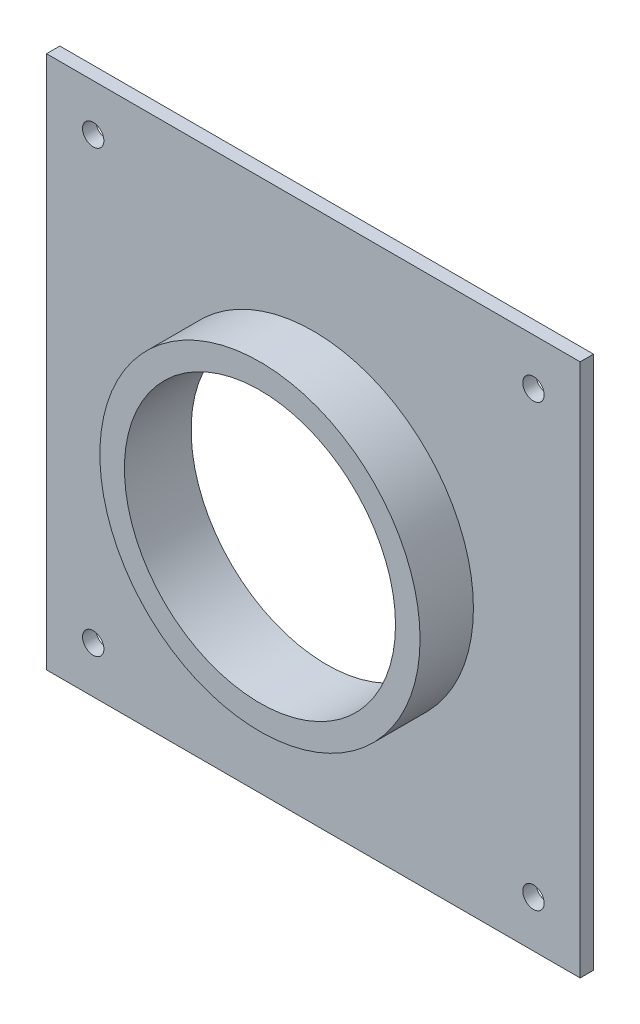
ISO-10303-21;
HEADER;
FILE_DESCRIPTION(('STEP AP214'),'2;1');
FILE_NAME('part.step','',(''),(''),'','','');
FILE_SCHEMA(('AUTOMOTIVE_DESIGN { 1 0 10303 214 1 1 1 1 }'));
ENDSEC;
DATA;
#1=APPLICATION_CONTEXT('core data for automotive mechanical design processes');
#2=APPLICATION_PROTOCOL_DEFINITION('international standard','automotive_design',2000,#1);
#3=PRODUCT_CONTEXT('',#1,'mechanical');
#4=PRODUCT('Part','Part','',(#3));
#5=PRODUCT_RELATED_PRODUCT_CATEGORY('part','',(#4));
#6=PRODUCT_DEFINITION_FORMATION('','',#4);
#7=PRODUCT_DEFINITION_CONTEXT('part definition',#1,'design');
#8=PRODUCT_DEFINITION('design','',#6,#7);
#9=PRODUCT_DEFINITION_SHAPE('','',#8);
#10=(LENGTH_UNIT() NAMED_UNIT(*) SI_UNIT(.MILLI.,.METRE.));
#11=(NAMED_UNIT(*) PLANE_ANGLE_UNIT() SI_UNIT($,.RADIAN.));
#12=(NAMED_UNIT(*) SI_UNIT($,.STERADIAN.) SOLID_ANGLE_UNIT());
#13=UNCERTAINTY_MEASURE_WITH_UNIT(LENGTH_MEASURE(1.E-05),#10,'distance_accuracy_value','');
#14=(GEOMETRIC_REPRESENTATION_CONTEXT(3) GLOBAL_UNCERTAINTY_ASSIGNED_CONTEXT((#13)) GLOBAL_UNIT_ASSIGNED_CONTEXT((#10,
#11,#12)) REPRESENTATION_CONTEXT('',''));
#15=CARTESIAN_POINT('',(0.,0.,0.));
#16=DIRECTION('',(0.,0.,1.));
#17=DIRECTION('',(1.,0.,0.));
#18=AXIS2_PLACEMENT_3D('',#15,#16,#17);
#19=CARTESIAN_POINT('',(0.,0.,1.));
#20=DIRECTION('',(0.,0.,1.));
#21=DIRECTION('',(1.,0.,0.));
#22=AXIS2_PLACEMENT_3D('',#19,#20,#21);
#23=PLANE('',#22);
#24=CARTESIAN_POINT('',(-16.5,16.5,1.));
#25=DIRECTION('',(0.,0.,1.));
#26=DIRECTION('',(1.,0.,0.));
#27=AXIS2_PLACEMENT_3D('',#24,#25,#26);
#28=CIRCLE('',#27,0.799999999999992);
#29=CARTESIAN_POINT('',(-15.7,16.5,1.));
#30=VERTEX_POINT('',#29);
#31=EDGE_CURVE('E157',#30,#30,#28,.T.);
#32=ORIENTED_EDGE('',*,*,#31,.F.);
#33=EDGE_LOOP('',(#32));
#34=FACE_BOUND('',#33,.T.);
#35=CARTESIAN_POINT('',(16.5,16.5,1.));
#36=DIRECTION('',(0.,0.,1.));
#37=DIRECTION('',(1.,0.,0.));
#38=AXIS2_PLACEMENT_3D('',#35,#36,#37);
#39=CIRCLE('',#38,0.799999999999988);
#40=CARTESIAN_POINT('',(17.3,16.5,1.));
#41=VERTEX_POINT('',#40);
#42=EDGE_CURVE('E144',#41,#41,#39,.T.);
#43=ORIENTED_EDGE('',*,*,#42,.F.);
#44=EDGE_LOOP('',(#43));
#45=FACE_BOUND('',#44,.T.);
#46=CARTESIAN_POINT('',(16.5000000000004,-16.5,1.));
#47=DIRECTION('',(0.,0.,1.));
#48=DIRECTION('',(1.,0.,0.));
#49=AXIS2_PLACEMENT_3D('',#46,#47,#48);
#50=CIRCLE('',#49,0.799999999999988);
#51=CARTESIAN_POINT('',(17.3000000000004,-16.5,1.));
#52=VERTEX_POINT('',#51);
#53=EDGE_CURVE('E140',#52,#52,#50,.T.);
#54=ORIENTED_EDGE('',*,*,#53,.F.);
#55=EDGE_LOOP('',(#54));
#56=FACE_BOUND('',#55,.T.);
#57=CARTESIAN_POINT('',(-16.4999999999996,-16.5,1.));
#58=DIRECTION('',(0.,0.,1.));
#59=DIRECTION('',(1.,0.,0.));
#60=AXIS2_PLACEMENT_3D('',#57,#58,#59);
#61=CIRCLE('',#60,0.799999999999992);
#62=CARTESIAN_POINT('',(-15.6999999999996,-16.5,1.));
#63=VERTEX_POINT('',#62);
#64=EDGE_CURVE('E136',#63,#63,#61,.T.);
#65=ORIENTED_EDGE('',*,*,#64,.F.);
#66=EDGE_LOOP('',(#65));
#67=FACE_BOUND('',#66,.T.);
#68=DIRECTION('',(-1.,0.,0.));
#69=VECTOR('',#68,1.);
#70=CARTESIAN_POINT('',(0.,20.,1.));
#71=LINE('',#70,#69);
#72=CARTESIAN_POINT('',(20.,20.,1.));
#73=VERTEX_POINT('',#72);
#74=CARTESIAN_POINT('',(-20.,20.,1.));
#75=VERTEX_POINT('',#74);
#76=EDGE_CURVE('E115',#73,#75,#71,.T.);
#77=ORIENTED_EDGE('',*,*,#76,.T.);
#78=DIRECTION('',(0.,-1.,0.));
#79=VECTOR('',#78,1.);
#80=CARTESIAN_POINT('',(-20.,0.,1.));
#81=LINE('',#80,#79);
#82=CARTESIAN_POINT('',(-20.,-20.,1.));
#83=VERTEX_POINT('',#82);
#84=EDGE_CURVE('E135',#75,#83,#81,.T.);
#85=ORIENTED_EDGE('',*,*,#84,.T.);
#86=DIRECTION('',(-1.,0.,0.));
#87=VECTOR('',#86,1.);
#88=CARTESIAN_POINT('',(0.,-20.,1.));
#89=LINE('',#88,#87);
#90=CARTESIAN_POINT('',(20.,-20.,1.));
#91=VERTEX_POINT('',#90);
#92=EDGE_CURVE('E96',#91,#83,#89,.T.);
#93=ORIENTED_EDGE('',*,*,#92,.F.);
#94=DIRECTION('',(0.,1.,0.));
#95=VECTOR('',#94,1.);
#96=CARTESIAN_POINT('',(20.,0.,1.));
#97=LINE('',#96,#95);
#98=EDGE_CURVE('E93',#91,#73,#97,.T.);
#99=ORIENTED_EDGE('',*,*,#98,.T.);
#100=EDGE_LOOP('',(#77,#85,#93,#99));
#101=FACE_BOUND('',#100,.T.);
#102=CARTESIAN_POINT('',(0.,0.,1.));
#103=DIRECTION('',(0.,0.,1.));
#104=DIRECTION('',(1.,0.,0.));
#105=AXIS2_PLACEMENT_3D('',#102,#103,#104);
#106=CIRCLE('',#105,12.);
#107=CARTESIAN_POINT('',(12.,0.,1.));
#108=VERTEX_POINT('',#107);
#109=EDGE_CURVE('E107',#108,#108,#106,.F.);
#110=ORIENTED_EDGE('',*,*,#109,.T.);
#111=EDGE_LOOP('',(#110));
#112=FACE_BOUND('',#111,.T.);
#113=ADVANCED_FACE('F49',(#34,#45,#56,#67,#101,#112),#23,.T.);
#114=CARTESIAN_POINT('',(0.,0.,5.));
#115=DIRECTION('',(0.,0.,1.));
#116=DIRECTION('',(1.,0.,0.));
#117=AXIS2_PLACEMENT_3D('',#114,#115,#116);
#118=PLANE('',#117);
#119=CARTESIAN_POINT('',(0.,0.,5.));
#120=DIRECTION('',(0.,0.,1.));
#121=DIRECTION('',(1.,0.,0.));
#122=AXIS2_PLACEMENT_3D('',#119,#120,#121);
#123=CIRCLE('',#122,10.16);
#124=CARTESIAN_POINT('',(10.16,0.,5.));
#125=VERTEX_POINT('',#124);
#126=EDGE_CURVE('E11',#125,#125,#123,.T.);
#127=ORIENTED_EDGE('',*,*,#126,.F.);
#128=EDGE_LOOP('',(#127));
#129=FACE_BOUND('',#128,.T.);
#130=CARTESIAN_POINT('',(0.,0.,5.));
#131=DIRECTION('',(0.,0.,1.));
#132=DIRECTION('',(1.,0.,0.));
#133=AXIS2_PLACEMENT_3D('',#130,#131,#132);
#134=CIRCLE('',#133,12.);
#135=CARTESIAN_POINT('',(12.,0.,5.));
#136=VERTEX_POINT('',#135);
#137=EDGE_CURVE('E166',#136,#136,#134,.T.);
#138=ORIENTED_EDGE('',*,*,#137,.T.);
#139=EDGE_LOOP('',(#138));
#140=FACE_BOUND('',#139,.T.);
#141=ADVANCED_FACE('F189',(#129,#140),#118,.T.);
#142=CARTESIAN_POINT('',(0.,0.,5.));
#143=DIRECTION('',(0.,0.,-1.));
#144=DIRECTION('',(-1.,0.,0.));
#145=AXIS2_PLACEMENT_3D('',#142,#143,#144);
#146=CYLINDRICAL_SURFACE('',#145,10.16);
#147=ORIENTED_EDGE('',*,*,#126,.T.);
#148=EDGE_LOOP('',(#147));
#149=FACE_BOUND('',#148,.T.);
#150=CARTESIAN_POINT('',(0.,0.,0.));
#151=DIRECTION('',(0.,0.,1.));
#152=DIRECTION('',(1.,0.,0.));
#153=AXIS2_PLACEMENT_3D('',#150,#151,#152);
#154=CIRCLE('',#153,10.16);
#155=CARTESIAN_POINT('',(10.16,0.,0.));
#156=VERTEX_POINT('',#155);
#157=EDGE_CURVE('E60',#156,#156,#154,.T.);
#158=ORIENTED_EDGE('',*,*,#157,.F.);
#159=EDGE_LOOP('',(#158));
#160=FACE_BOUND('',#159,.T.);
#161=ADVANCED_FACE('F51',(#149,#160),#146,.F.);
#162=CARTESIAN_POINT('',(0.,0.,0.));
#163=DIRECTION('',(0.,0.,1.));
#164=DIRECTION('',(1.,0.,0.));
#165=AXIS2_PLACEMENT_3D('',#162,#163,#164);
#166=PLANE('',#165);
#167=CARTESIAN_POINT('',(-16.5,16.5,0.));
#168=DIRECTION('',(0.,0.,1.));
#169=DIRECTION('',(1.,0.,0.));
#170=AXIS2_PLACEMENT_3D('',#167,#168,#169);
#171=CIRCLE('',#170,0.79999999999999);
#172=CARTESIAN_POINT('',(-15.7,16.5,0.));
#173=VERTEX_POINT('',#172);
#174=EDGE_CURVE('E53',#173,#173,#171,.T.);
#175=ORIENTED_EDGE('',*,*,#174,.T.);
#176=EDGE_LOOP('',(#175));
#177=FACE_BOUND('',#176,.T.);
#178=CARTESIAN_POINT('',(16.5,16.5,0.));
#179=DIRECTION('',(0.,0.,1.));
#180=DIRECTION('',(1.,0.,0.));
#181=AXIS2_PLACEMENT_3D('',#178,#179,#180);
#182=CIRCLE('',#181,0.799999999999988);
#183=CARTESIAN_POINT('',(17.3,16.5,0.));
#184=VERTEX_POINT('',#183);
#185=EDGE_CURVE('E141',#184,#184,#182,.T.);
#186=ORIENTED_EDGE('',*,*,#185,.T.);
#187=EDGE_LOOP('',(#186));
#188=FACE_BOUND('',#187,.T.);
#189=CARTESIAN_POINT('',(16.5000000000004,-16.5,0.));
#190=DIRECTION('',(0.,0.,1.));
#191=DIRECTION('',(1.,0.,0.));
#192=AXIS2_PLACEMENT_3D('',#189,#190,#191);
#193=CIRCLE('',#192,0.799999999999988);
#194=CARTESIAN_POINT('',(17.3000000000004,-16.5,0.));
#195=VERTEX_POINT('',#194);
#196=EDGE_CURVE('E137',#195,#195,#193,.T.);
#197=ORIENTED_EDGE('',*,*,#196,.T.);
#198=EDGE_LOOP('',(#197));
#199=FACE_BOUND('',#198,.T.);
#200=CARTESIAN_POINT('',(-16.4999999999996,-16.5,0.));
#201=DIRECTION('',(0.,0.,1.));
#202=DIRECTION('',(1.,0.,0.));
#203=AXIS2_PLACEMENT_3D('',#200,#201,#202);
#204=CIRCLE('',#203,0.79999999999999);
#205=CARTESIAN_POINT('',(-15.6999999999996,-16.5,0.));
#206=VERTEX_POINT('',#205);
#207=EDGE_CURVE('E131',#206,#206,#204,.T.);
#208=ORIENTED_EDGE('',*,*,#207,.T.);
#209=EDGE_LOOP('',(#208));
#210=FACE_BOUND('',#209,.T.);
#211=ORIENTED_EDGE('',*,*,#157,.T.);
#212=EDGE_LOOP('',(#211));
#213=FACE_BOUND('',#212,.T.);
#214=DIRECTION('',(0.,1.,0.));
#215=VECTOR('',#214,1.);
#216=CARTESIAN_POINT('',(20.,0.,0.));
#217=LINE('',#216,#215);
#218=CARTESIAN_POINT('',(20.,-20.,0.));
#219=VERTEX_POINT('',#218);
#220=CARTESIAN_POINT('',(20.,20.,0.));
#221=VERTEX_POINT('',#220);
#222=EDGE_CURVE('E91',#219,#221,#217,.T.);
#223=ORIENTED_EDGE('',*,*,#222,.F.);
#224=DIRECTION('',(-1.,0.,0.));
#225=VECTOR('',#224,1.);
#226=CARTESIAN_POINT('',(0.,-20.,0.));
#227=LINE('',#226,#225);
#228=CARTESIAN_POINT('',(-20.,-20.,0.));
#229=VERTEX_POINT('',#228);
#230=EDGE_CURVE('E102',#219,#229,#227,.T.);
#231=ORIENTED_EDGE('',*,*,#230,.T.);
#232=DIRECTION('',(0.,1.,0.));
#233=VECTOR('',#232,1.);
#234=CARTESIAN_POINT('',(-20.,0.,0.));
#235=LINE('',#234,#233);
#236=CARTESIAN_POINT('',(-20.,20.,0.));
#237=VERTEX_POINT('',#236);
#238=EDGE_CURVE('E111',#229,#237,#235,.T.);
#239=ORIENTED_EDGE('',*,*,#238,.T.);
#240=DIRECTION('',(-1.,0.,0.));
#241=VECTOR('',#240,1.);
#242=CARTESIAN_POINT('',(0.,20.,0.));
#243=LINE('',#242,#241);
#244=EDGE_CURVE('E104',#221,#237,#243,.T.);
#245=ORIENTED_EDGE('',*,*,#244,.F.);
#246=EDGE_LOOP('',(#223,#231,#239,#245));
#247=FACE_BOUND('',#246,.T.);
#248=ADVANCED_FACE('F100',(#177,#188,#199,#210,#213,#247),#166,.F.);
#249=CARTESIAN_POINT('',(20.,0.,1.));
#250=DIRECTION('',(-1.,0.,0.));
#251=DIRECTION('',(0.,0.,1.));
#252=AXIS2_PLACEMENT_3D('',#249,#250,#251);
#253=PLANE('',#252);
#254=ORIENTED_EDGE('',*,*,#222,.T.);
#255=DIRECTION('',(0.,0.,-1.));
#256=VECTOR('',#255,1.);
#257=CARTESIAN_POINT('',(20.,20.,1.));
#258=LINE('',#257,#256);
#259=EDGE_CURVE('E125',#73,#221,#258,.T.);
#260=ORIENTED_EDGE('',*,*,#259,.F.);
#261=ORIENTED_EDGE('',*,*,#98,.F.);
#262=DIRECTION('',(0.,0.,-1.));
#263=VECTOR('',#262,1.);
#264=CARTESIAN_POINT('',(20.,-20.,1.));
#265=LINE('',#264,#263);
#266=EDGE_CURVE('E69',#91,#219,#265,.T.);
#267=ORIENTED_EDGE('',*,*,#266,.T.);
#268=EDGE_LOOP('',(#254,#260,#261,#267));
#269=FACE_BOUND('',#268,.T.);
#270=ADVANCED_FACE('F89',(#269),#253,.F.);
#271=CARTESIAN_POINT('',(0.,20.,1.));
#272=DIRECTION('',(0.,-1.,0.));
#273=DIRECTION('',(0.,0.,-1.));
#274=AXIS2_PLACEMENT_3D('',#271,#272,#273);
#275=PLANE('',#274);
#276=DIRECTION('',(0.,0.,-1.));
#277=VECTOR('',#276,1.);
#278=CARTESIAN_POINT('',(-20.,20.,1.));
#279=LINE('',#278,#277);
#280=EDGE_CURVE('E122',#75,#237,#279,.T.);
#281=ORIENTED_EDGE('',*,*,#280,.F.);
#282=ORIENTED_EDGE('',*,*,#76,.F.);
#283=ORIENTED_EDGE('',*,*,#259,.T.);
#284=ORIENTED_EDGE('',*,*,#244,.T.);
#285=EDGE_LOOP('',(#281,#282,#283,#284));
#286=FACE_BOUND('',#285,.T.);
#287=ADVANCED_FACE('F180',(#286),#275,.F.);
#288=CARTESIAN_POINT('',(-20.,0.,1.));
#289=DIRECTION('',(-1.,0.,0.));
#290=DIRECTION('',(0.,0.,1.));
#291=AXIS2_PLACEMENT_3D('',#288,#289,#290);
#292=PLANE('',#291);
#293=ORIENTED_EDGE('',*,*,#84,.F.);
#294=ORIENTED_EDGE('',*,*,#280,.T.);
#295=ORIENTED_EDGE('',*,*,#238,.F.);
#296=DIRECTION('',(0.,0.,-1.));
#297=VECTOR('',#296,1.);
#298=CARTESIAN_POINT('',(-20.,-20.,1.));
#299=LINE('',#298,#297);
#300=EDGE_CURVE('E84',#83,#229,#299,.T.);
#301=ORIENTED_EDGE('',*,*,#300,.F.);
#302=EDGE_LOOP('',(#293,#294,#295,#301));
#303=FACE_BOUND('',#302,.T.);
#304=ADVANCED_FACE('F183',(#303),#292,.T.);
#305=CARTESIAN_POINT('',(0.,-20.,1.));
#306=DIRECTION('',(0.,-1.,0.));
#307=DIRECTION('',(0.,0.,-1.));
#308=AXIS2_PLACEMENT_3D('',#305,#306,#307);
#309=PLANE('',#308);
#310=ORIENTED_EDGE('',*,*,#92,.T.);
#311=ORIENTED_EDGE('',*,*,#300,.T.);
#312=ORIENTED_EDGE('',*,*,#230,.F.);
#313=ORIENTED_EDGE('',*,*,#266,.F.);
#314=EDGE_LOOP('',(#310,#311,#312,#313));
#315=FACE_BOUND('',#314,.T.);
#316=ADVANCED_FACE('F109',(#315),#309,.T.);
#317=CARTESIAN_POINT('',(0.,0.,-38.5979797464467));
#318=DIRECTION('',(0.,0.,1.));
#319=DIRECTION('',(1.,0.,0.));
#320=AXIS2_PLACEMENT_3D('',#317,#318,#319);
#321=CYLINDRICAL_SURFACE('',#320,12.);
#322=CARTESIAN_POINT('',(12.,0.,1.));
#323=CARTESIAN_POINT('',(12.,0.,1.04166666666667));
#324=CARTESIAN_POINT('',(12.,0.,1.08333333333333));
#325=CARTESIAN_POINT('',(12.,0.,1.16666666666667));
#326=CARTESIAN_POINT('',(12.,0.,1.20833333333333));
#327=CARTESIAN_POINT('',(12.,0.,1.29166666666667));
#328=CARTESIAN_POINT('',(12.,0.,1.33333333333333));
#329=CARTESIAN_POINT('',(12.,0.,1.41666666666667));
#330=CARTESIAN_POINT('',(12.,0.,1.45833333333333));
#331=CARTESIAN_POINT('',(12.,0.,1.54166666666667));
#332=CARTESIAN_POINT('',(12.,0.,1.58333333333333));
#333=CARTESIAN_POINT('',(12.,0.,1.66666666666667));
#334=CARTESIAN_POINT('',(12.,0.,1.70833333333333));
#335=CARTESIAN_POINT('',(12.,0.,1.79166666666667));
#336=CARTESIAN_POINT('',(12.,0.,1.83333333333334));
#337=CARTESIAN_POINT('',(12.,0.,1.91666666666667));
#338=CARTESIAN_POINT('',(12.,0.,1.95833333333334));
#339=CARTESIAN_POINT('',(12.,0.,2.04166666666667));
#340=CARTESIAN_POINT('',(12.,0.,2.08333333333334));
#341=CARTESIAN_POINT('',(12.,0.,2.16666666666667));
#342=CARTESIAN_POINT('',(12.,0.,2.20833333333334));
#343=CARTESIAN_POINT('',(12.,0.,2.29166666666667));
#344=CARTESIAN_POINT('',(12.,0.,2.33333333333334));
#345=CARTESIAN_POINT('',(12.,0.,2.41666666666667));
#346=CARTESIAN_POINT('',(12.,0.,2.45833333333334));
#347=CARTESIAN_POINT('',(12.,0.,2.54166666666667));
#348=CARTESIAN_POINT('',(12.,0.,2.58333333333334));
#349=CARTESIAN_POINT('',(12.,0.,2.66666666666667));
#350=CARTESIAN_POINT('',(12.,0.,2.70833333333334));
#351=CARTESIAN_POINT('',(12.,0.,2.79166666666667));
#352=CARTESIAN_POINT('',(12.,0.,2.83333333333334));
#353=CARTESIAN_POINT('',(12.,0.,2.91666666666667));
#354=CARTESIAN_POINT('',(12.,0.,2.95833333333334));
#355=CARTESIAN_POINT('',(12.,0.,3.04166666666667));
#356=CARTESIAN_POINT('',(12.,0.,3.08333333333334));
#357=CARTESIAN_POINT('',(12.,0.,3.16666666666667));
#358=CARTESIAN_POINT('',(12.,0.,3.20833333333334));
#359=CARTESIAN_POINT('',(12.,0.,3.29166666666667));
#360=CARTESIAN_POINT('',(12.,0.,3.33333333333334));
#361=CARTESIAN_POINT('',(12.,0.,3.41666666666667));
#362=CARTESIAN_POINT('',(12.,0.,3.45833333333334));
#363=CARTESIAN_POINT('',(12.,0.,3.54166666666667));
#364=CARTESIAN_POINT('',(12.,0.,3.58333333333334));
#365=CARTESIAN_POINT('',(12.,0.,3.66666666666667));
#366=CARTESIAN_POINT('',(12.,0.,3.70833333333334));
#367=CARTESIAN_POINT('',(12.,0.,3.79166666666667));
#368=CARTESIAN_POINT('',(12.,0.,3.83333333333334));
#369=CARTESIAN_POINT('',(12.,0.,3.91666666666667));
#370=CARTESIAN_POINT('',(12.,0.,3.95833333333334));
#371=CARTESIAN_POINT('',(12.,0.,4.04166666666667));
#372=CARTESIAN_POINT('',(12.,0.,4.08333333333334));
#373=CARTESIAN_POINT('',(12.,0.,4.16666666666667));
#374=CARTESIAN_POINT('',(12.,0.,4.20833333333334));
#375=CARTESIAN_POINT('',(12.,0.,4.29166666666667));
#376=CARTESIAN_POINT('',(12.,0.,4.33333333333334));
#377=CARTESIAN_POINT('',(12.,0.,4.41666666666667));
#378=CARTESIAN_POINT('',(12.,0.,4.45833333333334));
#379=CARTESIAN_POINT('',(12.,0.,4.54166666666667));
#380=CARTESIAN_POINT('',(12.,0.,4.58333333333334));
#381=CARTESIAN_POINT('',(12.,0.,4.66666666666667));
#382=CARTESIAN_POINT('',(12.,0.,4.70833333333334));
#383=CARTESIAN_POINT('',(12.,0.,4.79166666666667));
#384=CARTESIAN_POINT('',(12.,0.,4.83333333333334));
#385=CARTESIAN_POINT('',(12.,0.,4.91666666666667));
#386=CARTESIAN_POINT('',(12.,0.,4.95833333333334));
#387=CARTESIAN_POINT('',(12.,0.,5.));
#388=B_SPLINE_CURVE_WITH_KNOTS('',3,(#322,#323,#324,#325,#326,#327,#328,#329,#330,#331,#332,
#333,#334,#335,#336,#337,#338,#339,#340,#341,#342,#343,#344,#345,#346,#347,#348,#349,#350,#351,
#352,#353,#354,#355,#356,#357,#358,#359,#360,#361,#362,#363,#364,#365,#366,#367,#368,#369,#370,
#371,#372,#373,#374,#375,#376,#377,#378,#379,#380,#381,#382,#383,#384,#385,#386,#387),
.UNSPECIFIED.,.F.,.F.,(4,2,2,2,2,2,2,2,2,2,2,2,2,2,2,2,2,2,2,2,2,2,2,2,2,2,2,2,2,2,2,2,4),(0.,
0.125,0.25,0.375,0.5,0.625000000000001,0.750000000000001,0.875000000000001,1.,1.125,1.25,1.375,
1.5,1.625,1.75,1.875,2.,2.125,2.25,2.375,2.5,2.625,2.75,2.875,3.,3.125,3.25,3.375,3.5,3.625,
3.75,3.875,4.),.UNSPECIFIED.);
#389=EDGE_CURVE('BSEAM194',#108,#136,#388,.T.);
#390=ORIENTED_EDGE('',*,*,#109,.F.);
#391=ORIENTED_EDGE('',*,*,#137,.F.);
#392=ORIENTED_EDGE('',*,*,#389,.T.);
#393=ORIENTED_EDGE('',*,*,#389,.F.);
#394=EDGE_LOOP('',(#390,#392,#391,#393));
#395=FACE_BOUND('',#394,.T.);
#396=ADVANCED_FACE('F194',(#395),#321,.T.);
#397=CARTESIAN_POINT('',(-16.4999999999996,-16.5,1.));
#398=DIRECTION('',(0.,0.,1.));
#399=DIRECTION('',(1.,0.,0.));
#400=AXIS2_PLACEMENT_3D('',#397,#398,#399);
#401=CYLINDRICAL_SURFACE('',#400,0.79999999999999);
#402=ORIENTED_EDGE('',*,*,#64,.T.);
#403=EDGE_LOOP('',(#402));
#404=FACE_BOUND('',#403,.T.);
#405=ORIENTED_EDGE('',*,*,#207,.F.);
#406=EDGE_LOOP('',(#405));
#407=FACE_BOUND('',#406,.T.);
#408=ADVANCED_FACE('F197',(#404,#407),#401,.F.);
#409=CARTESIAN_POINT('',(16.5000000000004,-16.5,1.));
#410=DIRECTION('',(0.,0.,1.));
#411=DIRECTION('',(1.,0.,0.));
#412=AXIS2_PLACEMENT_3D('',#409,#410,#411);
#413=CYLINDRICAL_SURFACE('',#412,0.799999999999988);
#414=ORIENTED_EDGE('',*,*,#53,.T.);
#415=EDGE_LOOP('',(#414));
#416=FACE_BOUND('',#415,.T.);
#417=ORIENTED_EDGE('',*,*,#196,.F.);
#418=EDGE_LOOP('',(#417));
#419=FACE_BOUND('',#418,.T.);
#420=ADVANCED_FACE('F228',(#416,#419),#413,.F.);
#421=CARTESIAN_POINT('',(16.5,16.5,1.));
#422=DIRECTION('',(0.,0.,1.));
#423=DIRECTION('',(1.,0.,0.));
#424=AXIS2_PLACEMENT_3D('',#421,#422,#423);
#425=CYLINDRICAL_SURFACE('',#424,0.799999999999988);
#426=ORIENTED_EDGE('',*,*,#42,.T.);
#427=EDGE_LOOP('',(#426));
#428=FACE_BOUND('',#427,.T.);
#429=ORIENTED_EDGE('',*,*,#185,.F.);
#430=EDGE_LOOP('',(#429));
#431=FACE_BOUND('',#430,.T.);
#432=ADVANCED_FACE('F234',(#428,#431),#425,.F.);
#433=CARTESIAN_POINT('',(-16.5,16.5,1.));
#434=DIRECTION('',(0.,0.,1.));
#435=DIRECTION('',(1.,0.,0.));
#436=AXIS2_PLACEMENT_3D('',#433,#434,#435);
#437=CYLINDRICAL_SURFACE('',#436,0.79999999999999);
#438=ORIENTED_EDGE('',*,*,#31,.T.);
#439=EDGE_LOOP('',(#438));
#440=FACE_BOUND('',#439,.T.);
#441=ORIENTED_EDGE('',*,*,#174,.F.);
#442=EDGE_LOOP('',(#441));
#443=FACE_BOUND('',#442,.T.);
#444=ADVANCED_FACE('F291',(#440,#443),#437,.F.);
#445=CLOSED_SHELL('',(#113,#141,#161,#248,#270,#287,#304,#316,#396,#408,#420,#432,#444));
#446=MANIFOLD_SOLID_BREP('B2',#445);
#447=ADVANCED_BREP_SHAPE_REPRESENTATION('',(#18,#446),#14);
#448=SHAPE_DEFINITION_REPRESENTATION(#9,#447);
ENDSEC;
END-ISO-10303-21;
